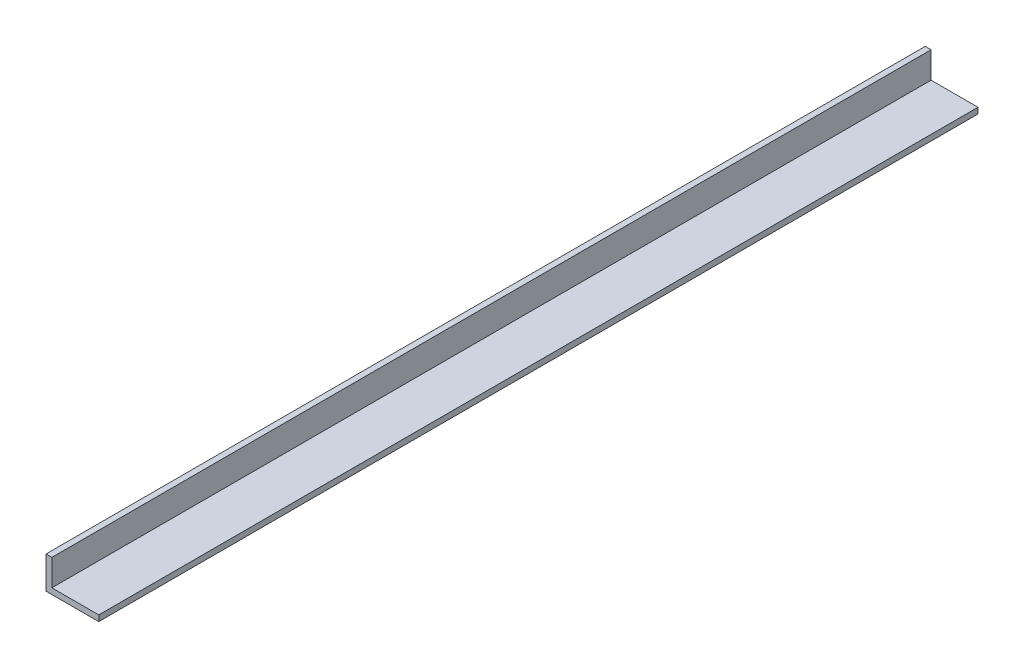
ISO-10303-21;
HEADER;
FILE_DESCRIPTION(('STEP AP214'),'2;1');
FILE_NAME('part.step','',(''),(''),'','','');
FILE_SCHEMA(('AUTOMOTIVE_DESIGN { 1 0 10303 214 1 1 1 1 }'));
ENDSEC;
DATA;
#1=APPLICATION_CONTEXT('core data for automotive mechanical design processes');
#2=APPLICATION_PROTOCOL_DEFINITION('international standard','automotive_design',2000,#1);
#3=PRODUCT_CONTEXT('',#1,'mechanical');
#4=PRODUCT('Part','Part','',(#3));
#5=PRODUCT_RELATED_PRODUCT_CATEGORY('part','',(#4));
#6=PRODUCT_DEFINITION_FORMATION('','',#4);
#7=PRODUCT_DEFINITION_CONTEXT('part definition',#1,'design');
#8=PRODUCT_DEFINITION('design','',#6,#7);
#9=PRODUCT_DEFINITION_SHAPE('','',#8);
#10=(LENGTH_UNIT() NAMED_UNIT(*) SI_UNIT(.MILLI.,.METRE.));
#11=(NAMED_UNIT(*) PLANE_ANGLE_UNIT() SI_UNIT($,.RADIAN.));
#12=(NAMED_UNIT(*) SI_UNIT($,.STERADIAN.) SOLID_ANGLE_UNIT());
#13=UNCERTAINTY_MEASURE_WITH_UNIT(LENGTH_MEASURE(1.E-05),#10,'distance_accuracy_value','');
#14=(GEOMETRIC_REPRESENTATION_CONTEXT(3) GLOBAL_UNCERTAINTY_ASSIGNED_CONTEXT((#13)) GLOBAL_UNIT_ASSIGNED_CONTEXT((#10,
#11,#12)) REPRESENTATION_CONTEXT('',''));
#15=CARTESIAN_POINT('',(0.,0.,0.));
#16=DIRECTION('',(0.,0.,1.));
#17=DIRECTION('',(1.,0.,0.));
#18=AXIS2_PLACEMENT_3D('',#15,#16,#17);
#19=CARTESIAN_POINT('',(3.175,17.4625,476.25));
#20=DIRECTION('',(0.,-1.,0.));
#21=DIRECTION('',(0.,0.,-1.));
#22=AXIS2_PLACEMENT_3D('',#19,#20,#21);
#23=PLANE('',#22);
#24=DIRECTION('',(-1.,0.,0.));
#25=VECTOR('',#24,1.);
#26=CARTESIAN_POINT('',(3.175,17.4625,0.));
#27=LINE('',#26,#25);
#28=CARTESIAN_POINT('',(3.175,17.4625,0.));
#29=VERTEX_POINT('',#28);
#30=CARTESIAN_POINT('',(0.,17.4625,0.));
#31=VERTEX_POINT('',#30);
#32=EDGE_CURVE('E128',#29,#31,#27,.T.);
#33=ORIENTED_EDGE('',*,*,#32,.T.);
#34=DIRECTION('',(0.,0.,-1.));
#35=VECTOR('',#34,1.);
#36=CARTESIAN_POINT('',(0.,17.4625,476.25));
#37=LINE('',#36,#35);
#38=CARTESIAN_POINT('',(0.,17.4625,476.25));
#39=VERTEX_POINT('',#38);
#40=EDGE_CURVE('E11',#39,#31,#37,.T.);
#41=ORIENTED_EDGE('',*,*,#40,.F.);
#42=DIRECTION('',(-1.,0.,0.));
#43=VECTOR('',#42,1.);
#44=CARTESIAN_POINT('',(3.175,17.4625,476.25));
#45=LINE('',#44,#43);
#46=CARTESIAN_POINT('',(3.175,17.4625,476.25));
#47=VERTEX_POINT('',#46);
#48=EDGE_CURVE('E144',#47,#39,#45,.T.);
#49=ORIENTED_EDGE('',*,*,#48,.F.);
#50=DIRECTION('',(0.,0.,-1.));
#51=VECTOR('',#50,1.);
#52=CARTESIAN_POINT('',(3.175,17.4625,476.25));
#53=LINE('',#52,#51);
#54=EDGE_CURVE('E124',#47,#29,#53,.T.);
#55=ORIENTED_EDGE('',*,*,#54,.T.);
#56=EDGE_LOOP('',(#33,#41,#49,#55));
#57=FACE_BOUND('',#56,.T.);
#58=ADVANCED_FACE('F39',(#57),#23,.F.);
#59=CARTESIAN_POINT('',(0.,17.4625,476.25));
#60=DIRECTION('',(1.,0.,0.));
#61=DIRECTION('',(0.,1.,0.));
#62=AXIS2_PLACEMENT_3D('',#59,#60,#61);
#63=PLANE('',#62);
#64=DIRECTION('',(0.,-1.,0.));
#65=VECTOR('',#64,1.);
#66=CARTESIAN_POINT('',(0.,17.4625,0.));
#67=LINE('',#66,#65);
#68=CARTESIAN_POINT('',(0.,0.,0.));
#69=VERTEX_POINT('',#68);
#70=EDGE_CURVE('E132',#31,#69,#67,.T.);
#71=ORIENTED_EDGE('',*,*,#70,.T.);
#72=DIRECTION('',(0.,0.,-1.));
#73=VECTOR('',#72,1.);
#74=CARTESIAN_POINT('',(0.,0.,476.25));
#75=LINE('',#74,#73);
#76=CARTESIAN_POINT('',(0.,0.,476.25));
#77=VERTEX_POINT('',#76);
#78=EDGE_CURVE('E48',#77,#69,#75,.T.);
#79=ORIENTED_EDGE('',*,*,#78,.F.);
#80=DIRECTION('',(0.,-1.,0.));
#81=VECTOR('',#80,1.);
#82=CARTESIAN_POINT('',(0.,17.4625,476.25));
#83=LINE('',#82,#81);
#84=EDGE_CURVE('E93',#39,#77,#83,.T.);
#85=ORIENTED_EDGE('',*,*,#84,.F.);
#86=ORIENTED_EDGE('',*,*,#40,.T.);
#87=EDGE_LOOP('',(#71,#79,#85,#86));
#88=FACE_BOUND('',#87,.T.);
#89=ADVANCED_FACE('F172',(#88),#63,.F.);
#90=CARTESIAN_POINT('',(0.,0.,476.25));
#91=DIRECTION('',(0.,1.,0.));
#92=DIRECTION('',(0.,0.,1.));
#93=AXIS2_PLACEMENT_3D('',#90,#91,#92);
#94=PLANE('',#93);
#95=DIRECTION('',(1.,0.,0.));
#96=VECTOR('',#95,1.);
#97=CARTESIAN_POINT('',(0.,0.,0.));
#98=LINE('',#97,#96);
#99=CARTESIAN_POINT('',(28.575,0.,0.));
#100=VERTEX_POINT('',#99);
#101=EDGE_CURVE('E135',#69,#100,#98,.T.);
#102=ORIENTED_EDGE('',*,*,#101,.T.);
#103=DIRECTION('',(0.,0.,-1.));
#104=VECTOR('',#103,1.);
#105=CARTESIAN_POINT('',(28.575,0.,476.25));
#106=LINE('',#105,#104);
#107=CARTESIAN_POINT('',(28.575,0.,476.25));
#108=VERTEX_POINT('',#107);
#109=EDGE_CURVE('E117',#108,#100,#106,.T.);
#110=ORIENTED_EDGE('',*,*,#109,.F.);
#111=DIRECTION('',(1.,0.,0.));
#112=VECTOR('',#111,1.);
#113=CARTESIAN_POINT('',(0.,0.,476.25));
#114=LINE('',#113,#112);
#115=EDGE_CURVE('E106',#77,#108,#114,.T.);
#116=ORIENTED_EDGE('',*,*,#115,.F.);
#117=ORIENTED_EDGE('',*,*,#78,.T.);
#118=EDGE_LOOP('',(#102,#110,#116,#117));
#119=FACE_BOUND('',#118,.T.);
#120=ADVANCED_FACE('F154',(#119),#94,.F.);
#121=CARTESIAN_POINT('',(28.575,0.,476.25));
#122=DIRECTION('',(-1.,0.,0.));
#123=DIRECTION('',(0.,0.,1.));
#124=AXIS2_PLACEMENT_3D('',#121,#122,#123);
#125=PLANE('',#124);
#126=DIRECTION('',(0.,1.,0.));
#127=VECTOR('',#126,1.);
#128=CARTESIAN_POINT('',(28.575,0.,0.));
#129=LINE('',#128,#127);
#130=CARTESIAN_POINT('',(28.575,3.175,0.));
#131=VERTEX_POINT('',#130);
#132=EDGE_CURVE('E115',#100,#131,#129,.T.);
#133=ORIENTED_EDGE('',*,*,#132,.T.);
#134=DIRECTION('',(0.,0.,-1.));
#135=VECTOR('',#134,1.);
#136=CARTESIAN_POINT('',(28.575,3.175,476.25));
#137=LINE('',#136,#135);
#138=CARTESIAN_POINT('',(28.575,3.175,476.25));
#139=VERTEX_POINT('',#138);
#140=EDGE_CURVE('E112',#139,#131,#137,.T.);
#141=ORIENTED_EDGE('',*,*,#140,.F.);
#142=DIRECTION('',(0.,1.,0.));
#143=VECTOR('',#142,1.);
#144=CARTESIAN_POINT('',(28.575,0.,476.25));
#145=LINE('',#144,#143);
#146=EDGE_CURVE('E100',#108,#139,#145,.T.);
#147=ORIENTED_EDGE('',*,*,#146,.F.);
#148=ORIENTED_EDGE('',*,*,#109,.T.);
#149=EDGE_LOOP('',(#133,#141,#147,#148));
#150=FACE_BOUND('',#149,.T.);
#151=ADVANCED_FACE('F113',(#150),#125,.F.);
#152=CARTESIAN_POINT('',(28.575,3.175,476.25));
#153=DIRECTION('',(0.,-1.,0.));
#154=DIRECTION('',(1.,0.,0.));
#155=AXIS2_PLACEMENT_3D('',#152,#153,#154);
#156=PLANE('',#155);
#157=DIRECTION('',(-1.,0.,0.));
#158=VECTOR('',#157,1.);
#159=CARTESIAN_POINT('',(28.575,3.175,0.));
#160=LINE('',#159,#158);
#161=CARTESIAN_POINT('',(3.175,3.17499999999999,0.));
#162=VERTEX_POINT('',#161);
#163=EDGE_CURVE('E79',#131,#162,#160,.T.);
#164=ORIENTED_EDGE('',*,*,#163,.T.);
#165=DIRECTION('',(0.,0.,-1.));
#166=VECTOR('',#165,1.);
#167=CARTESIAN_POINT('',(3.175,3.17499999999999,476.25));
#168=LINE('',#167,#166);
#169=CARTESIAN_POINT('',(3.175,3.17499999999999,476.25));
#170=VERTEX_POINT('',#169);
#171=EDGE_CURVE('E118',#170,#162,#168,.T.);
#172=ORIENTED_EDGE('',*,*,#171,.F.);
#173=DIRECTION('',(-1.,0.,0.));
#174=VECTOR('',#173,1.);
#175=CARTESIAN_POINT('',(28.575,3.175,476.25));
#176=LINE('',#175,#174);
#177=EDGE_CURVE('E104',#139,#170,#176,.T.);
#178=ORIENTED_EDGE('',*,*,#177,.F.);
#179=ORIENTED_EDGE('',*,*,#140,.T.);
#180=EDGE_LOOP('',(#164,#172,#178,#179));
#181=FACE_BOUND('',#180,.T.);
#182=ADVANCED_FACE('F120',(#181),#156,.F.);
#183=CARTESIAN_POINT('',(3.175,3.17499999999999,476.25));
#184=DIRECTION('',(-1.,0.,0.));
#185=DIRECTION('',(0.,0.,1.));
#186=AXIS2_PLACEMENT_3D('',#183,#184,#185);
#187=PLANE('',#186);
#188=DIRECTION('',(0.,1.,0.));
#189=VECTOR('',#188,1.);
#190=CARTESIAN_POINT('',(3.175,3.17499999999999,0.));
#191=LINE('',#190,#189);
#192=EDGE_CURVE('E85',#162,#29,#191,.T.);
#193=ORIENTED_EDGE('',*,*,#192,.T.);
#194=ORIENTED_EDGE('',*,*,#54,.F.);
#195=DIRECTION('',(0.,1.,0.));
#196=VECTOR('',#195,1.);
#197=CARTESIAN_POINT('',(3.175,3.17499999999999,476.25));
#198=LINE('',#197,#196);
#199=EDGE_CURVE('E56',#170,#47,#198,.T.);
#200=ORIENTED_EDGE('',*,*,#199,.F.);
#201=ORIENTED_EDGE('',*,*,#171,.T.);
#202=EDGE_LOOP('',(#193,#194,#200,#201));
#203=FACE_BOUND('',#202,.T.);
#204=ADVANCED_FACE('F161',(#203),#187,.F.);
#205=CARTESIAN_POINT('',(0.,0.,476.25));
#206=DIRECTION('',(0.,0.,1.));
#207=DIRECTION('',(1.,0.,0.));
#208=AXIS2_PLACEMENT_3D('',#205,#206,#207);
#209=PLANE('',#208);
#210=ORIENTED_EDGE('',*,*,#48,.T.);
#211=ORIENTED_EDGE('',*,*,#84,.T.);
#212=ORIENTED_EDGE('',*,*,#115,.T.);
#213=ORIENTED_EDGE('',*,*,#146,.T.);
#214=ORIENTED_EDGE('',*,*,#177,.T.);
#215=ORIENTED_EDGE('',*,*,#199,.T.);
#216=EDGE_LOOP('',(#210,#211,#212,#213,#214,#215));
#217=FACE_BOUND('',#216,.T.);
#218=ADVANCED_FACE('F102',(#217),#209,.T.);
#219=CARTESIAN_POINT('',(0.,0.,0.));
#220=DIRECTION('',(0.,0.,1.));
#221=DIRECTION('',(1.,0.,0.));
#222=AXIS2_PLACEMENT_3D('',#219,#220,#221);
#223=PLANE('',#222);
#224=ORIENTED_EDGE('',*,*,#32,.F.);
#225=ORIENTED_EDGE('',*,*,#192,.F.);
#226=ORIENTED_EDGE('',*,*,#163,.F.);
#227=ORIENTED_EDGE('',*,*,#132,.F.);
#228=ORIENTED_EDGE('',*,*,#101,.F.);
#229=ORIENTED_EDGE('',*,*,#70,.F.);
#230=EDGE_LOOP('',(#224,#225,#226,#227,#228,#229));
#231=FACE_BOUND('',#230,.T.);
#232=ADVANCED_FACE('F157',(#231),#223,.F.);
#233=CLOSED_SHELL('',(#58,#89,#120,#151,#182,#204,#218,#232));
#234=MANIFOLD_SOLID_BREP('B2',#233);
#235=ADVANCED_BREP_SHAPE_REPRESENTATION('',(#18,#234),#14);
#236=SHAPE_DEFINITION_REPRESENTATION(#9,#235);
ENDSEC;
END-ISO-10303-21;
